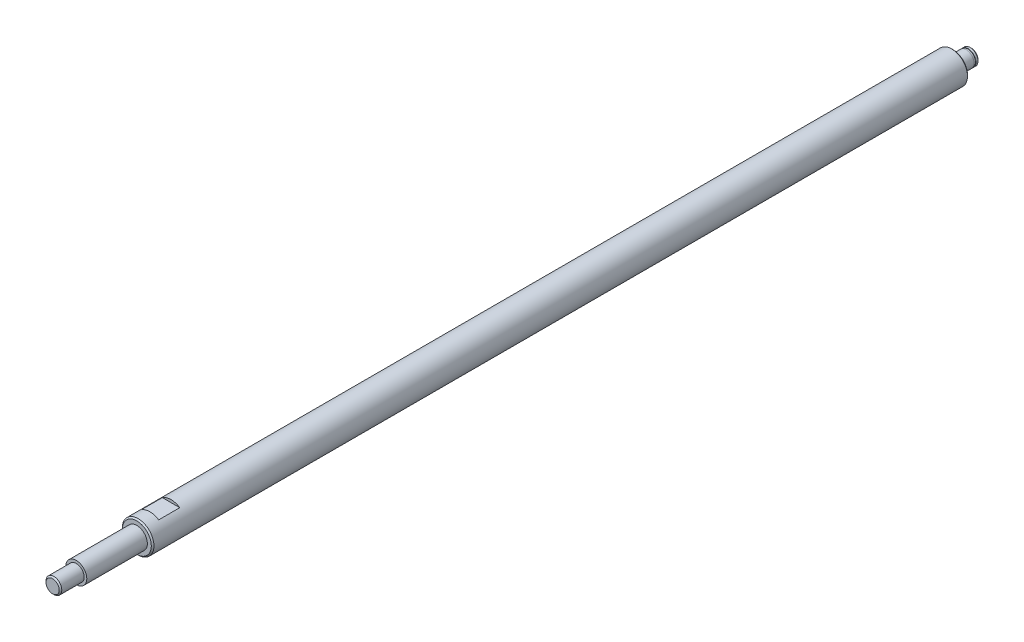
ISO-10303-21;
HEADER;
FILE_DESCRIPTION(('STEP AP214'),'2;1');
FILE_NAME('part.step','',(''),(''),'','','');
FILE_SCHEMA(('AUTOMOTIVE_DESIGN { 1 0 10303 214 1 1 1 1 }'));
ENDSEC;
DATA;
#1=APPLICATION_CONTEXT('core data for automotive mechanical design processes');
#2=APPLICATION_PROTOCOL_DEFINITION('international standard','automotive_design',2000,#1);
#3=PRODUCT_CONTEXT('',#1,'mechanical');
#4=PRODUCT('Part','Part','',(#3));
#5=PRODUCT_RELATED_PRODUCT_CATEGORY('part','',(#4));
#6=PRODUCT_DEFINITION_FORMATION('','',#4);
#7=PRODUCT_DEFINITION_CONTEXT('part definition',#1,'design');
#8=PRODUCT_DEFINITION('design','',#6,#7);
#9=PRODUCT_DEFINITION_SHAPE('','',#8);
#10=(LENGTH_UNIT() NAMED_UNIT(*) SI_UNIT(.MILLI.,.METRE.));
#11=(NAMED_UNIT(*) PLANE_ANGLE_UNIT() SI_UNIT($,.RADIAN.));
#12=(NAMED_UNIT(*) SI_UNIT($,.STERADIAN.) SOLID_ANGLE_UNIT());
#13=UNCERTAINTY_MEASURE_WITH_UNIT(LENGTH_MEASURE(1.E-05),#10,'distance_accuracy_value','');
#14=(GEOMETRIC_REPRESENTATION_CONTEXT(3) GLOBAL_UNCERTAINTY_ASSIGNED_CONTEXT((#13)) GLOBAL_UNIT_ASSIGNED_CONTEXT((#10,
#11,#12)) REPRESENTATION_CONTEXT('',''));
#15=CARTESIAN_POINT('',(0.,0.,0.));
#16=DIRECTION('',(0.,0.,1.));
#17=DIRECTION('',(1.,0.,0.));
#18=AXIS2_PLACEMENT_3D('',#15,#16,#17);
#19=CARTESIAN_POINT('',(0.,0.,155.));
#20=DIRECTION('',(0.,0.,-1.));
#21=DIRECTION('',(-1.,0.,0.));
#22=AXIS2_PLACEMENT_3D('',#19,#20,#21);
#23=CYLINDRICAL_SURFACE('',#22,6.);
#24=DIRECTION('',(0.,0.,-1.));
#25=VECTOR('',#24,1.);
#26=CARTESIAN_POINT('',(-3.3166247903554,5.,155.));
#27=LINE('',#26,#25);
#28=CARTESIAN_POINT('',(-3.3166247903554,5.,142.));
#29=VERTEX_POINT('',#28);
#30=CARTESIAN_POINT('',(-3.3166247903554,5.,150.));
#31=VERTEX_POINT('',#30);
#32=EDGE_CURVE('E95',#29,#31,#27,.F.);
#33=ORIENTED_EDGE('',*,*,#32,.F.);
#34=CARTESIAN_POINT('',(0.,0.,142.));
#35=DIRECTION('',(0.,0.,-1.));
#36=DIRECTION('',(-1.,0.,0.));
#37=AXIS2_PLACEMENT_3D('',#34,#35,#36);
#38=CIRCLE('',#37,6.);
#39=CARTESIAN_POINT('',(3.3166247903554,5.,142.));
#40=VERTEX_POINT('',#39);
#41=EDGE_CURVE('E59',#29,#40,#38,.T.);
#42=ORIENTED_EDGE('',*,*,#41,.T.);
#43=DIRECTION('',(0.,0.,-1.));
#44=VECTOR('',#43,1.);
#45=CARTESIAN_POINT('',(3.3166247903554,5.,155.));
#46=LINE('',#45,#44);
#47=CARTESIAN_POINT('',(3.3166247903554,5.,150.));
#48=VERTEX_POINT('',#47);
#49=EDGE_CURVE('E93',#48,#40,#46,.T.);
#50=ORIENTED_EDGE('',*,*,#49,.F.);
#51=CARTESIAN_POINT('',(0.,0.,150.));
#52=DIRECTION('',(0.,0.,1.));
#53=DIRECTION('',(1.,0.,0.));
#54=AXIS2_PLACEMENT_3D('',#51,#52,#53);
#55=CIRCLE('',#54,6.);
#56=EDGE_CURVE('E100',#48,#31,#55,.T.);
#57=ORIENTED_EDGE('',*,*,#56,.T.);
#58=EDGE_LOOP('',(#33,#42,#50,#57));
#59=FACE_BOUND('',#58,.T.);
#60=CARTESIAN_POINT('',(0.,0.,154.5));
#61=DIRECTION('',(0.,0.,1.));
#62=DIRECTION('',(1.,0.,0.));
#63=AXIS2_PLACEMENT_3D('',#60,#61,#62);
#64=CIRCLE('',#63,6.);
#65=CARTESIAN_POINT('',(6.,0.,154.5));
#66=VERTEX_POINT('',#65);
#67=EDGE_CURVE('E112',#66,#66,#64,.F.);
#68=ORIENTED_EDGE('',*,*,#67,.T.);
#69=EDGE_LOOP('',(#68));
#70=FACE_BOUND('',#69,.T.);
#71=CARTESIAN_POINT('',(0.,0.,-154.5));
#72=DIRECTION('',(0.,0.,1.));
#73=DIRECTION('',(1.,0.,0.));
#74=AXIS2_PLACEMENT_3D('',#71,#72,#73);
#75=CIRCLE('',#74,6.);
#76=CARTESIAN_POINT('',(6.,0.,-154.5));
#77=VERTEX_POINT('',#76);
#78=EDGE_CURVE('E115',#77,#77,#75,.T.);
#79=ORIENTED_EDGE('',*,*,#78,.T.);
#80=EDGE_LOOP('',(#79));
#81=FACE_BOUND('',#80,.T.);
#82=CARTESIAN_POINT('',(0.,0.,150.));
#83=DIRECTION('',(0.,0.,-1.));
#84=DIRECTION('',(-1.,0.,0.));
#85=AXIS2_PLACEMENT_3D('',#82,#83,#84);
#86=CIRCLE('',#85,6.);
#87=CARTESIAN_POINT('',(3.3166247903554,-5.,150.));
#88=VERTEX_POINT('',#87);
#89=CARTESIAN_POINT('',(-3.3166247903554,-5.,150.));
#90=VERTEX_POINT('',#89);
#91=EDGE_CURVE('E80',#88,#90,#86,.T.);
#92=ORIENTED_EDGE('',*,*,#91,.F.);
#93=DIRECTION('',(0.,0.,-1.));
#94=VECTOR('',#93,1.);
#95=CARTESIAN_POINT('',(3.3166247903554,-5.,155.));
#96=LINE('',#95,#94);
#97=CARTESIAN_POINT('',(3.3166247903554,-5.,142.));
#98=VERTEX_POINT('',#97);
#99=EDGE_CURVE('E46',#98,#88,#96,.F.);
#100=ORIENTED_EDGE('',*,*,#99,.F.);
#101=CARTESIAN_POINT('',(0.,0.,142.));
#102=DIRECTION('',(0.,0.,1.));
#103=DIRECTION('',(1.,0.,0.));
#104=AXIS2_PLACEMENT_3D('',#101,#102,#103);
#105=CIRCLE('',#104,6.);
#106=CARTESIAN_POINT('',(-3.3166247903554,-5.,142.));
#107=VERTEX_POINT('',#106);
#108=EDGE_CURVE('E87',#107,#98,#105,.T.);
#109=ORIENTED_EDGE('',*,*,#108,.F.);
#110=DIRECTION('',(0.,0.,-1.));
#111=VECTOR('',#110,1.);
#112=CARTESIAN_POINT('',(-3.3166247903554,-5.,155.));
#113=LINE('',#112,#111);
#114=EDGE_CURVE('E11',#90,#107,#113,.T.);
#115=ORIENTED_EDGE('',*,*,#114,.F.);
#116=EDGE_LOOP('',(#92,#100,#109,#115));
#117=FACE_BOUND('',#116,.T.);
#118=ADVANCED_FACE('F38',(#59,#70,#81,#117),#23,.T.);
#119=CARTESIAN_POINT('',(0.,0.,178.));
#120=DIRECTION('',(0.,0.,1.));
#121=DIRECTION('',(1.,0.,0.));
#122=AXIS2_PLACEMENT_3D('',#119,#120,#121);
#123=PLANE('',#122);
#124=CARTESIAN_POINT('',(0.,0.,178.));
#125=DIRECTION('',(0.,0.,1.));
#126=DIRECTION('',(1.,0.,0.));
#127=AXIS2_PLACEMENT_3D('',#124,#125,#126);
#128=CIRCLE('',#127,4.);
#129=CARTESIAN_POINT('',(4.,0.,178.));
#130=VERTEX_POINT('',#129);
#131=EDGE_CURVE('E140',#130,#130,#128,.T.);
#132=ORIENTED_EDGE('',*,*,#131,.T.);
#133=EDGE_LOOP('',(#132));
#134=FACE_BOUND('',#133,.T.);
#135=CARTESIAN_POINT('',(0.,0.,178.));
#136=DIRECTION('',(0.,0.,1.));
#137=DIRECTION('',(1.,0.,0.));
#138=AXIS2_PLACEMENT_3D('',#135,#136,#137);
#139=CIRCLE('',#138,3.);
#140=CARTESIAN_POINT('',(3.,0.,178.));
#141=VERTEX_POINT('',#140);
#142=EDGE_CURVE('E146',#141,#141,#139,.T.);
#143=ORIENTED_EDGE('',*,*,#142,.F.);
#144=EDGE_LOOP('',(#143));
#145=FACE_BOUND('',#144,.T.);
#146=ADVANCED_FACE('F167',(#134,#145),#123,.T.);
#147=CARTESIAN_POINT('',(0.,0.,155.));
#148=DIRECTION('',(0.,0.,1.));
#149=DIRECTION('',(1.,0.,0.));
#150=AXIS2_PLACEMENT_3D('',#147,#148,#149);
#151=PLANE('',#150);
#152=CARTESIAN_POINT('',(0.,0.,155.));
#153=DIRECTION('',(0.,0.,1.));
#154=DIRECTION('',(1.,0.,0.));
#155=AXIS2_PLACEMENT_3D('',#152,#153,#154);
#156=CIRCLE('',#155,5.50000000000003);
#157=CARTESIAN_POINT('',(5.50000000000003,0.,155.));
#158=VERTEX_POINT('',#157);
#159=EDGE_CURVE('E118',#158,#158,#156,.T.);
#160=ORIENTED_EDGE('',*,*,#159,.T.);
#161=EDGE_LOOP('',(#160));
#162=FACE_BOUND('',#161,.T.);
#163=CARTESIAN_POINT('',(0.,0.,155.));
#164=DIRECTION('',(0.,0.,1.));
#165=DIRECTION('',(1.,0.,0.));
#166=AXIS2_PLACEMENT_3D('',#163,#164,#165);
#167=CIRCLE('',#166,4.);
#168=CARTESIAN_POINT('',(4.,0.,155.));
#169=VERTEX_POINT('',#168);
#170=EDGE_CURVE('E143',#169,#169,#167,.T.);
#171=ORIENTED_EDGE('',*,*,#170,.F.);
#172=EDGE_LOOP('',(#171));
#173=FACE_BOUND('',#172,.T.);
#174=ADVANCED_FACE('F173',(#162,#173),#151,.T.);
#175=CARTESIAN_POINT('',(0.,0.,-162.));
#176=DIRECTION('',(0.,0.,1.));
#177=DIRECTION('',(1.,0.,0.));
#178=AXIS2_PLACEMENT_3D('',#175,#176,#177);
#179=CYLINDRICAL_SURFACE('',#178,3.);
#180=CARTESIAN_POINT('',(0.,0.,-155.));
#181=DIRECTION('',(0.,0.,1.));
#182=DIRECTION('',(1.,0.,0.));
#183=AXIS2_PLACEMENT_3D('',#180,#181,#182);
#184=CIRCLE('',#183,3.);
#185=CARTESIAN_POINT('',(3.,0.,-155.));
#186=VERTEX_POINT('',#185);
#187=EDGE_CURVE('E127',#186,#186,#184,.F.);
#188=ORIENTED_EDGE('',*,*,#187,.T.);
#189=EDGE_LOOP('',(#188));
#190=FACE_BOUND('',#189,.T.);
#191=CARTESIAN_POINT('',(0.,0.,-160.));
#192=DIRECTION('',(0.,0.,-1.));
#193=DIRECTION('',(-1.,0.,0.));
#194=AXIS2_PLACEMENT_3D('',#191,#192,#193);
#195=CIRCLE('',#194,3.);
#196=CARTESIAN_POINT('',(-3.,0.,-160.));
#197=VERTEX_POINT('',#196);
#198=EDGE_CURVE('E131',#197,#197,#195,.T.);
#199=ORIENTED_EDGE('',*,*,#198,.F.);
#200=EDGE_LOOP('',(#199));
#201=FACE_BOUND('',#200,.T.);
#202=ADVANCED_FACE('F206',(#190,#201),#179,.T.);
#203=CARTESIAN_POINT('',(0.,0.,-155.));
#204=DIRECTION('',(0.,0.,1.));
#205=DIRECTION('',(1.,0.,0.));
#206=AXIS2_PLACEMENT_3D('',#203,#204,#205);
#207=PLANE('',#206);
#208=CARTESIAN_POINT('',(0.,0.,-155.));
#209=DIRECTION('',(0.,0.,1.));
#210=DIRECTION('',(1.,0.,0.));
#211=AXIS2_PLACEMENT_3D('',#208,#209,#210);
#212=CIRCLE('',#211,5.50000000000006);
#213=CARTESIAN_POINT('',(5.50000000000006,0.,-155.));
#214=VERTEX_POINT('',#213);
#215=EDGE_CURVE('E109',#214,#214,#212,.F.);
#216=ORIENTED_EDGE('',*,*,#215,.T.);
#217=EDGE_LOOP('',(#216));
#218=FACE_BOUND('',#217,.T.);
#219=ORIENTED_EDGE('',*,*,#187,.F.);
#220=EDGE_LOOP('',(#219));
#221=FACE_BOUND('',#220,.T.);
#222=ADVANCED_FACE('F180',(#218,#221),#207,.F.);
#223=CARTESIAN_POINT('',(0.,0.,-160.7));
#224=DIRECTION('',(0.,0.,-1.));
#225=DIRECTION('',(-1.,0.,0.));
#226=AXIS2_PLACEMENT_3D('',#223,#224,#225);
#227=PLANE('',#226);
#228=CARTESIAN_POINT('',(0.,0.,-160.7));
#229=DIRECTION('',(0.,0.,-1.));
#230=DIRECTION('',(-1.,0.,0.));
#231=AXIS2_PLACEMENT_3D('',#228,#229,#230);
#232=CIRCLE('',#231,3.);
#233=CARTESIAN_POINT('',(-3.,0.,-160.7));
#234=VERTEX_POINT('',#233);
#235=EDGE_CURVE('E130',#234,#234,#232,.T.);
#236=ORIENTED_EDGE('',*,*,#235,.F.);
#237=EDGE_LOOP('',(#236));
#238=FACE_BOUND('',#237,.T.);
#239=CARTESIAN_POINT('',(0.,0.,-160.7));
#240=DIRECTION('',(0.,0.,-1.));
#241=DIRECTION('',(-1.,0.,0.));
#242=AXIS2_PLACEMENT_3D('',#239,#240,#241);
#243=CIRCLE('',#242,2.85);
#244=CARTESIAN_POINT('',(-2.85,0.,-160.7));
#245=VERTEX_POINT('',#244);
#246=EDGE_CURVE('E134',#245,#245,#243,.T.);
#247=ORIENTED_EDGE('',*,*,#246,.T.);
#248=EDGE_LOOP('',(#247));
#249=FACE_BOUND('',#248,.T.);
#250=ADVANCED_FACE('F205',(#238,#249),#227,.F.);
#251=CARTESIAN_POINT('',(0.,0.,-160.));
#252=DIRECTION('',(0.,0.,-1.));
#253=DIRECTION('',(-1.,0.,0.));
#254=AXIS2_PLACEMENT_3D('',#251,#252,#253);
#255=PLANE('',#254);
#256=ORIENTED_EDGE('',*,*,#198,.T.);
#257=EDGE_LOOP('',(#256));
#258=FACE_BOUND('',#257,.T.);
#259=CARTESIAN_POINT('',(0.,0.,-160.));
#260=DIRECTION('',(0.,0.,-1.));
#261=DIRECTION('',(-1.,0.,0.));
#262=AXIS2_PLACEMENT_3D('',#259,#260,#261);
#263=CIRCLE('',#262,2.85);
#264=CARTESIAN_POINT('',(-2.85,0.,-160.));
#265=VERTEX_POINT('',#264);
#266=EDGE_CURVE('E137',#265,#265,#263,.T.);
#267=ORIENTED_EDGE('',*,*,#266,.F.);
#268=EDGE_LOOP('',(#267));
#269=FACE_BOUND('',#268,.T.);
#270=ADVANCED_FACE('F215',(#258,#269),#255,.T.);
#271=CARTESIAN_POINT('',(0.,0.,-160.7));
#272=DIRECTION('',(0.,0.,1.));
#273=DIRECTION('',(1.,0.,0.));
#274=AXIS2_PLACEMENT_3D('',#271,#272,#273);
#275=CYLINDRICAL_SURFACE('',#274,2.85);
#276=ORIENTED_EDGE('',*,*,#246,.F.);
#277=EDGE_LOOP('',(#276));
#278=FACE_BOUND('',#277,.T.);
#279=ORIENTED_EDGE('',*,*,#266,.T.);
#280=EDGE_LOOP('',(#279));
#281=FACE_BOUND('',#280,.T.);
#282=ADVANCED_FACE('F218',(#278,#281),#275,.T.);
#283=CARTESIAN_POINT('',(0.,0.,-162.));
#284=DIRECTION('',(0.,0.,-1.));
#285=DIRECTION('',(-1.,0.,0.));
#286=AXIS2_PLACEMENT_3D('',#283,#284,#285);
#287=PLANE('',#286);
#288=CARTESIAN_POINT('',(0.,0.,-162.));
#289=DIRECTION('',(0.,0.,-1.));
#290=DIRECTION('',(-1.,0.,0.));
#291=AXIS2_PLACEMENT_3D('',#288,#289,#290);
#292=CIRCLE('',#291,2.50000000000003);
#293=CARTESIAN_POINT('',(-2.50000000000003,0.,-162.));
#294=VERTEX_POINT('',#293);
#295=EDGE_CURVE('E106',#294,#294,#292,.T.);
#296=ORIENTED_EDGE('',*,*,#295,.T.);
#297=EDGE_LOOP('',(#296));
#298=FACE_BOUND('',#297,.T.);
#299=ADVANCED_FACE('F223',(#298),#287,.T.);
#300=CARTESIAN_POINT('',(0.,0.,-161.5));
#301=DIRECTION('',(0.,0.,-1.));
#302=DIRECTION('',(-1.,0.,0.));
#303=AXIS2_PLACEMENT_3D('',#300,#301,#302);
#304=CIRCLE('',#303,3.);
#305=CARTESIAN_POINT('',(-3.,0.,-161.5));
#306=VERTEX_POINT('',#305);
#307=EDGE_CURVE('E103',#306,#306,#304,.F.);
#308=ORIENTED_EDGE('',*,*,#307,.T.);
#309=EDGE_LOOP('',(#308));
#310=FACE_BOUND('',#309,.T.);
#311=ORIENTED_EDGE('',*,*,#235,.T.);
#312=EDGE_LOOP('',(#311));
#313=FACE_BOUND('',#312,.T.);
#314=ADVANCED_FACE('F212',(#310,#313),#179,.T.);
#315=CARTESIAN_POINT('',(0.,0.,178.));
#316=DIRECTION('',(0.,0.,-1.));
#317=DIRECTION('',(-1.,0.,0.));
#318=AXIS2_PLACEMENT_3D('',#315,#316,#317);
#319=CYLINDRICAL_SURFACE('',#318,4.);
#320=ORIENTED_EDGE('',*,*,#131,.F.);
#321=EDGE_LOOP('',(#320));
#322=FACE_BOUND('',#321,.T.);
#323=ORIENTED_EDGE('',*,*,#170,.T.);
#324=EDGE_LOOP('',(#323));
#325=FACE_BOUND('',#324,.T.);
#326=ADVANCED_FACE('F234',(#322,#325),#319,.T.);
#327=CARTESIAN_POINT('',(0.,0.,187.));
#328=DIRECTION('',(0.,0.,-1.));
#329=DIRECTION('',(-1.,0.,0.));
#330=AXIS2_PLACEMENT_3D('',#327,#328,#329);
#331=CYLINDRICAL_SURFACE('',#330,3.);
#332=CARTESIAN_POINT('',(0.,0.,186.5));
#333=DIRECTION('',(0.,0.,1.));
#334=DIRECTION('',(1.,0.,0.));
#335=AXIS2_PLACEMENT_3D('',#332,#333,#334);
#336=CIRCLE('',#335,3.);
#337=CARTESIAN_POINT('',(3.,0.,186.5));
#338=VERTEX_POINT('',#337);
#339=EDGE_CURVE('E121',#338,#338,#336,.F.);
#340=ORIENTED_EDGE('',*,*,#339,.T.);
#341=EDGE_LOOP('',(#340));
#342=FACE_BOUND('',#341,.T.);
#343=ORIENTED_EDGE('',*,*,#142,.T.);
#344=EDGE_LOOP('',(#343));
#345=FACE_BOUND('',#344,.T.);
#346=ADVANCED_FACE('F248',(#342,#345),#331,.T.);
#347=CARTESIAN_POINT('',(0.,0.,187.));
#348=DIRECTION('',(0.,0.,1.));
#349=DIRECTION('',(1.,0.,0.));
#350=AXIS2_PLACEMENT_3D('',#347,#348,#349);
#351=PLANE('',#350);
#352=CARTESIAN_POINT('',(0.,0.,187.));
#353=DIRECTION('',(0.,0.,1.));
#354=DIRECTION('',(1.,0.,0.));
#355=AXIS2_PLACEMENT_3D('',#352,#353,#354);
#356=CIRCLE('',#355,2.50000000000003);
#357=CARTESIAN_POINT('',(2.50000000000003,0.,187.));
#358=VERTEX_POINT('',#357);
#359=EDGE_CURVE('E124',#358,#358,#356,.T.);
#360=ORIENTED_EDGE('',*,*,#359,.T.);
#361=EDGE_LOOP('',(#360));
#362=FACE_BOUND('',#361,.T.);
#363=ADVANCED_FACE('F186',(#362),#351,.T.);
#364=CARTESIAN_POINT('',(0.,0.,187.));
#365=DIRECTION('',(0.,0.,-1.));
#366=DIRECTION('',(-1.,0.,0.));
#367=AXIS2_PLACEMENT_3D('',#364,#365,#366);
#368=CONICAL_SURFACE('',#367,2.50000000000003,0.785398163397446);
#369=ORIENTED_EDGE('',*,*,#339,.F.);
#370=EDGE_LOOP('',(#369));
#371=FACE_BOUND('',#370,.T.);
#372=ORIENTED_EDGE('',*,*,#359,.F.);
#373=EDGE_LOOP('',(#372));
#374=FACE_BOUND('',#373,.T.);
#375=ADVANCED_FACE('F182',(#371,#374),#368,.T.);
#376=CARTESIAN_POINT('',(0.,0.,155.));
#377=DIRECTION('',(0.,0.,-1.));
#378=DIRECTION('',(-1.,0.,0.));
#379=AXIS2_PLACEMENT_3D('',#376,#377,#378);
#380=CONICAL_SURFACE('',#379,5.50000000000003,0.785398163397414);
#381=ORIENTED_EDGE('',*,*,#67,.F.);
#382=EDGE_LOOP('',(#381));
#383=FACE_BOUND('',#382,.T.);
#384=ORIENTED_EDGE('',*,*,#159,.F.);
#385=EDGE_LOOP('',(#384));
#386=FACE_BOUND('',#385,.T.);
#387=ADVANCED_FACE('F185',(#383,#386),#380,.T.);
#388=CARTESIAN_POINT('',(0.,0.,-154.5));
#389=DIRECTION('',(0.,0.,1.));
#390=DIRECTION('',(1.,0.,0.));
#391=AXIS2_PLACEMENT_3D('',#388,#389,#390);
#392=CONICAL_SURFACE('',#391,6.,0.785398163397497);
#393=ORIENTED_EDGE('',*,*,#215,.F.);
#394=EDGE_LOOP('',(#393));
#395=FACE_BOUND('',#394,.T.);
#396=ORIENTED_EDGE('',*,*,#78,.F.);
#397=EDGE_LOOP('',(#396));
#398=FACE_BOUND('',#397,.T.);
#399=ADVANCED_FACE('F189',(#395,#398),#392,.T.);
#400=CARTESIAN_POINT('',(0.,0.,-162.));
#401=DIRECTION('',(0.,0.,1.));
#402=DIRECTION('',(1.,0.,0.));
#403=AXIS2_PLACEMENT_3D('',#400,#401,#402);
#404=CONICAL_SURFACE('',#403,2.50000000000003,0.785398163397446);
#405=ORIENTED_EDGE('',*,*,#307,.F.);
#406=EDGE_LOOP('',(#405));
#407=FACE_BOUND('',#406,.T.);
#408=ORIENTED_EDGE('',*,*,#295,.F.);
#409=EDGE_LOOP('',(#408));
#410=FACE_BOUND('',#409,.T.);
#411=ADVANCED_FACE('F40',(#407,#410),#404,.T.);
#412=CARTESIAN_POINT('',(-4.6509349742439,5.,142.));
#413=DIRECTION('',(0.,0.,-1.));
#414=DIRECTION('',(-1.,0.,0.));
#415=AXIS2_PLACEMENT_3D('',#412,#413,#414);
#416=PLANE('',#415);
#417=DIRECTION('',(-1.,0.,0.));
#418=VECTOR('',#417,1.);
#419=CARTESIAN_POINT('',(-4.6509349742439,5.,142.));
#420=LINE('',#419,#418);
#421=EDGE_CURVE('E151',#40,#29,#420,.T.);
#422=ORIENTED_EDGE('',*,*,#421,.F.);
#423=ORIENTED_EDGE('',*,*,#41,.F.);
#424=EDGE_LOOP('',(#422,#423));
#425=FACE_BOUND('',#424,.T.);
#426=ADVANCED_FACE('F196',(#425),#416,.F.);
#427=CARTESIAN_POINT('',(-4.6509349742439,5.,150.));
#428=DIRECTION('',(0.,0.,1.));
#429=DIRECTION('',(1.,0.,0.));
#430=AXIS2_PLACEMENT_3D('',#427,#428,#429);
#431=PLANE('',#430);
#432=DIRECTION('',(1.,0.,0.));
#433=VECTOR('',#432,1.);
#434=CARTESIAN_POINT('',(-4.6509349742439,5.,150.));
#435=LINE('',#434,#433);
#436=EDGE_CURVE('E90',#31,#48,#435,.T.);
#437=ORIENTED_EDGE('',*,*,#436,.F.);
#438=ORIENTED_EDGE('',*,*,#56,.F.);
#439=EDGE_LOOP('',(#437,#438));
#440=FACE_BOUND('',#439,.T.);
#441=ADVANCED_FACE('F265',(#440),#431,.F.);
#442=CARTESIAN_POINT('',(0.,5.,0.));
#443=DIRECTION('',(0.,1.,0.));
#444=DIRECTION('',(0.,0.,1.));
#445=AXIS2_PLACEMENT_3D('',#442,#443,#444);
#446=PLANE('',#445);
#447=ORIENTED_EDGE('',*,*,#49,.T.);
#448=ORIENTED_EDGE('',*,*,#421,.T.);
#449=ORIENTED_EDGE('',*,*,#32,.T.);
#450=ORIENTED_EDGE('',*,*,#436,.T.);
#451=EDGE_LOOP('',(#447,#448,#449,#450));
#452=FACE_BOUND('',#451,.T.);
#453=ADVANCED_FACE('F163',(#452),#446,.T.);
#454=CARTESIAN_POINT('',(-4.6509349742439,-5.,150.));
#455=DIRECTION('',(0.,0.,-1.));
#456=DIRECTION('',(-1.,0.,0.));
#457=AXIS2_PLACEMENT_3D('',#454,#455,#456);
#458=PLANE('',#457);
#459=DIRECTION('',(1.,0.,0.));
#460=VECTOR('',#459,1.);
#461=CARTESIAN_POINT('',(-4.6509349742439,-5.,150.));
#462=LINE('',#461,#460);
#463=EDGE_CURVE('E83',#90,#88,#462,.T.);
#464=ORIENTED_EDGE('',*,*,#463,.T.);
#465=ORIENTED_EDGE('',*,*,#91,.T.);
#466=EDGE_LOOP('',(#464,#465));
#467=FACE_BOUND('',#466,.T.);
#468=ADVANCED_FACE('F82',(#467),#458,.T.);
#469=CARTESIAN_POINT('',(-4.6509349742439,-5.,142.));
#470=DIRECTION('',(0.,0.,1.));
#471=DIRECTION('',(1.,0.,0.));
#472=AXIS2_PLACEMENT_3D('',#469,#470,#471);
#473=PLANE('',#472);
#474=DIRECTION('',(-1.,0.,0.));
#475=VECTOR('',#474,1.);
#476=CARTESIAN_POINT('',(-4.6509349742439,-5.,142.));
#477=LINE('',#476,#475);
#478=EDGE_CURVE('E52',#98,#107,#477,.T.);
#479=ORIENTED_EDGE('',*,*,#478,.T.);
#480=ORIENTED_EDGE('',*,*,#108,.T.);
#481=EDGE_LOOP('',(#479,#480));
#482=FACE_BOUND('',#481,.T.);
#483=ADVANCED_FACE('F155',(#482),#473,.T.);
#484=CARTESIAN_POINT('',(0.,-5.,0.));
#485=DIRECTION('',(0.,-1.,0.));
#486=DIRECTION('',(0.,0.,1.));
#487=AXIS2_PLACEMENT_3D('',#484,#485,#486);
#488=PLANE('',#487);
#489=ORIENTED_EDGE('',*,*,#114,.T.);
#490=ORIENTED_EDGE('',*,*,#478,.F.);
#491=ORIENTED_EDGE('',*,*,#99,.T.);
#492=ORIENTED_EDGE('',*,*,#463,.F.);
#493=EDGE_LOOP('',(#489,#490,#491,#492));
#494=FACE_BOUND('',#493,.T.);
#495=ADVANCED_FACE('F89',(#494),#488,.T.);
#496=CLOSED_SHELL('',(#118,#146,#174,#202,#222,#250,#270,#282,#299,#314,#326,#346,#363,#375,
#387,#399,#411,#426,#441,#453,#468,#483,#495));
#497=MANIFOLD_SOLID_BREP('B2',#496);
#498=ADVANCED_BREP_SHAPE_REPRESENTATION('',(#18,#497),#14);
#499=SHAPE_DEFINITION_REPRESENTATION(#9,#498);
ENDSEC;
END-ISO-10303-21;
